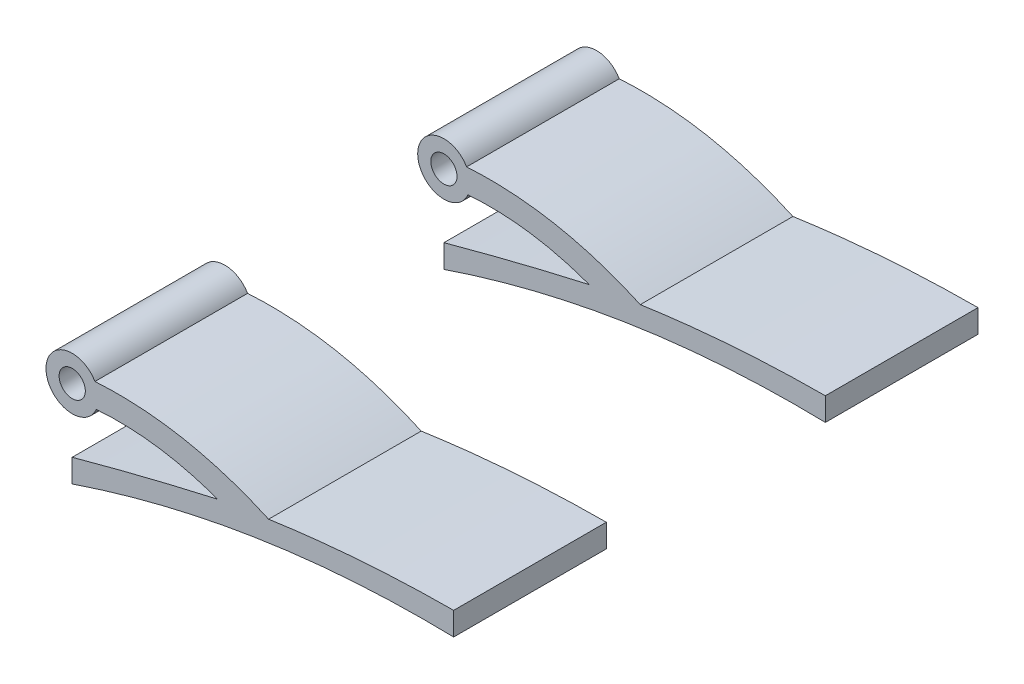
ISO-10303-21;
HEADER;
FILE_DESCRIPTION(('STEP AP214'),'2;1');
FILE_NAME('part.step','',(''),(''),'','','');
FILE_SCHEMA(('AUTOMOTIVE_DESIGN { 1 0 10303 214 1 1 1 1 }'));
ENDSEC;
DATA;
#1=APPLICATION_CONTEXT('core data for automotive mechanical design processes');
#2=APPLICATION_PROTOCOL_DEFINITION('international standard','automotive_design',2000,#1);
#3=PRODUCT_CONTEXT('',#1,'mechanical');
#4=PRODUCT('Part','Part','',(#3));
#5=PRODUCT_RELATED_PRODUCT_CATEGORY('part','',(#4));
#6=PRODUCT_DEFINITION_FORMATION('','',#4);
#7=PRODUCT_DEFINITION_CONTEXT('part definition',#1,'design');
#8=PRODUCT_DEFINITION('design','',#6,#7);
#9=PRODUCT_DEFINITION_SHAPE('','',#8);
#10=(LENGTH_UNIT() NAMED_UNIT(*) SI_UNIT(.MILLI.,.METRE.));
#11=(NAMED_UNIT(*) PLANE_ANGLE_UNIT() SI_UNIT($,.RADIAN.));
#12=(NAMED_UNIT(*) SI_UNIT($,.STERADIAN.) SOLID_ANGLE_UNIT());
#13=UNCERTAINTY_MEASURE_WITH_UNIT(LENGTH_MEASURE(1.E-05),#10,'distance_accuracy_value','');
#14=(GEOMETRIC_REPRESENTATION_CONTEXT(3) GLOBAL_UNCERTAINTY_ASSIGNED_CONTEXT((#13)) GLOBAL_UNIT_ASSIGNED_CONTEXT((#10,
#11,#12)) REPRESENTATION_CONTEXT('',''));
#15=CARTESIAN_POINT('',(0.,0.,0.));
#16=DIRECTION('',(0.,0.,1.));
#17=DIRECTION('',(1.,0.,0.));
#18=AXIS2_PLACEMENT_3D('',#15,#16,#17);
#19=CARTESIAN_POINT('',(0.,0.,254.));
#20=DIRECTION('',(0.,0.,-1.));
#21=DIRECTION('',(-1.,0.,0.));
#22=AXIS2_PLACEMENT_3D('',#19,#20,#21);
#23=CYLINDRICAL_SURFACE('',#22,25.4);
#24=CARTESIAN_POINT('',(0.,0.,-106.110786800683));
#25=DIRECTION('',(0.,0.,-1.));
#26=DIRECTION('',(-1.,0.,0.));
#27=AXIS2_PLACEMENT_3D('',#24,#25,#26);
#28=CIRCLE('',#27,25.4);
#29=CARTESIAN_POINT('',(23.3185784583835,-10.0699502819137,-106.110786800683));
#30=VERTEX_POINT('',#29);
#31=CARTESIAN_POINT('',(21.9970452561247,12.7,-106.110786800683));
#32=VERTEX_POINT('',#31);
#33=EDGE_CURVE('E69',#30,#32,#28,.T.);
#34=ORIENTED_EDGE('',*,*,#33,.T.);
#35=DIRECTION('',(0.,0.,-1.));
#36=VECTOR('',#35,1.);
#37=CARTESIAN_POINT('',(21.9970452561247,12.7,254.));
#38=LINE('',#37,#36);
#39=CARTESIAN_POINT('',(21.9970452561247,12.7,-254.));
#40=VERTEX_POINT('',#39);
#41=EDGE_CURVE('E318',#32,#40,#38,.T.);
#42=ORIENTED_EDGE('',*,*,#41,.T.);
#43=CARTESIAN_POINT('',(0.,0.,-254.));
#44=DIRECTION('',(0.,0.,1.));
#45=DIRECTION('',(1.,0.,0.));
#46=AXIS2_PLACEMENT_3D('',#43,#44,#45);
#47=CIRCLE('',#46,25.4);
#48=CARTESIAN_POINT('',(23.3185784583835,-10.0699502819137,-254.));
#49=VERTEX_POINT('',#48);
#50=EDGE_CURVE('E276',#40,#49,#47,.T.);
#51=ORIENTED_EDGE('',*,*,#50,.T.);
#52=DIRECTION('',(0.,0.,-1.));
#53=VECTOR('',#52,1.);
#54=CARTESIAN_POINT('',(23.3185784583835,-10.0699502819137,254.));
#55=LINE('',#54,#53);
#56=EDGE_CURVE('E305',#30,#49,#55,.T.);
#57=ORIENTED_EDGE('',*,*,#56,.F.);
#58=EDGE_LOOP('',(#34,#42,#51,#57));
#59=FACE_BOUND('',#58,.T.);
#60=ADVANCED_FACE('F49',(#59),#23,.T.);
#61=CARTESIAN_POINT('',(0.,0.,254.));
#62=DIRECTION('',(0.,0.,-1.));
#63=DIRECTION('',(-1.,0.,0.));
#64=AXIS2_PLACEMENT_3D('',#61,#62,#63);
#65=CYLINDRICAL_SURFACE('',#64,12.7);
#66=CARTESIAN_POINT('',(0.,0.,-106.110786800683));
#67=DIRECTION('',(0.,0.,-1.));
#68=DIRECTION('',(-1.,0.,0.));
#69=AXIS2_PLACEMENT_3D('',#66,#67,#68);
#70=CIRCLE('',#69,12.7);
#71=CARTESIAN_POINT('',(-12.7,0.,-106.110786800683));
#72=VERTEX_POINT('',#71);
#73=EDGE_CURVE('E12',#72,#72,#70,.T.);
#74=ORIENTED_EDGE('',*,*,#73,.F.);
#75=EDGE_LOOP('',(#74));
#76=FACE_BOUND('',#75,.T.);
#77=CARTESIAN_POINT('',(0.,0.,-254.));
#78=DIRECTION('',(0.,0.,1.));
#79=DIRECTION('',(1.,0.,0.));
#80=AXIS2_PLACEMENT_3D('',#77,#78,#79);
#81=CIRCLE('',#80,12.7);
#82=CARTESIAN_POINT('',(12.7,0.,-254.));
#83=VERTEX_POINT('',#82);
#84=EDGE_CURVE('E60',#83,#83,#81,.T.);
#85=ORIENTED_EDGE('',*,*,#84,.F.);
#86=EDGE_LOOP('',(#85));
#87=FACE_BOUND('',#86,.T.);
#88=ADVANCED_FACE('F160',(#76,#87),#65,.F.);
#89=CARTESIAN_POINT('',(190.25199529991,-18.7129449772534,254.));
#90=CARTESIAN_POINT('',(108.775317236133,18.1924732566216,254.));
#91=CARTESIAN_POINT('',(21.9970452561247,12.7,254.));
#92=B_SPLINE_CURVE_WITH_KNOTS('',2,(#89,#90,#91),.UNSPECIFIED.,.F.,.F.,(3,3),(0.,1.),.UNSPECIFIED.);
#93=DIRECTION('',(0.,0.,-1.));
#94=VECTOR('',#93,1.);
#95=SURFACE_OF_LINEAR_EXTRUSION('',#92,#94);
#96=ORIENTED_EDGE('',*,*,#41,.F.);
#97=CARTESIAN_POINT('',(190.25199529991,-18.7129449772534,-106.110786800683));
#98=CARTESIAN_POINT('',(108.775317236133,18.1924732566216,-106.110786800683));
#99=CARTESIAN_POINT('',(21.9970452561247,12.7,-106.110786800683));
#100=B_SPLINE_CURVE_WITH_KNOTS('',2,(#97,#98,#99),.UNSPECIFIED.,.F.,.F.,(3,3),(0.,1.),.UNSPECIFIED.);
#101=CARTESIAN_POINT('',(190.25199529991,-18.7129449772534,-106.110786800683));
#102=VERTEX_POINT('',#101);
#103=EDGE_CURVE('E140',#32,#102,#100,.F.);
#104=ORIENTED_EDGE('',*,*,#103,.T.);
#105=DIRECTION('',(0.,0.,-1.));
#106=VECTOR('',#105,1.);
#107=CARTESIAN_POINT('',(190.25199529991,-18.7129449772534,254.));
#108=LINE('',#107,#106);
#109=CARTESIAN_POINT('',(190.25199529991,-18.7129449772534,-254.));
#110=VERTEX_POINT('',#109);
#111=EDGE_CURVE('E136',#102,#110,#108,.T.);
#112=ORIENTED_EDGE('',*,*,#111,.T.);
#113=CARTESIAN_POINT('',(190.25199529991,-18.7129449772534,-254.));
#114=CARTESIAN_POINT('',(108.775317236133,18.1924732566216,-254.));
#115=CARTESIAN_POINT('',(21.9970452561247,12.7,-254.));
#116=B_SPLINE_CURVE_WITH_KNOTS('',2,(#113,#114,#115),.UNSPECIFIED.,.F.,.F.,(3,3),(0.,1.),.UNSPECIFIED.);
#117=EDGE_CURVE('E139',#110,#40,#116,.T.);
#118=ORIENTED_EDGE('',*,*,#117,.T.);
#119=EDGE_LOOP('',(#96,#104,#112,#118));
#120=FACE_BOUND('',#119,.T.);
#121=ADVANCED_FACE('F187',(#120),#95,.F.);
#122=CARTESIAN_POINT('',(23.3185784583835,-10.0699502819137,254.));
#123=CARTESIAN_POINT('',(83.5049903110363,-5.48230526075079,254.));
#124=CARTESIAN_POINT('',(140.749293009898,-26.6578724186735,254.));
#125=B_SPLINE_CURVE_WITH_KNOTS('',2,(#122,#123,#124),.UNSPECIFIED.,.F.,.F.,(3,3),(0.,1.),.UNSPECIFIED.);
#126=DIRECTION('',(0.,0.,-1.));
#127=VECTOR('',#126,1.);
#128=SURFACE_OF_LINEAR_EXTRUSION('',#125,#127);
#129=DIRECTION('',(0.,0.,-1.));
#130=VECTOR('',#129,1.);
#131=CARTESIAN_POINT('',(140.749293009898,-26.6578724186735,254.));
#132=LINE('',#131,#130);
#133=CARTESIAN_POINT('',(140.749293009898,-26.6578724186735,-106.110786800683));
#134=VERTEX_POINT('',#133);
#135=CARTESIAN_POINT('',(140.749293009898,-26.6578724186735,-254.));
#136=VERTEX_POINT('',#135);
#137=EDGE_CURVE('E296',#134,#136,#132,.T.);
#138=ORIENTED_EDGE('',*,*,#137,.F.);
#139=CARTESIAN_POINT('',(23.3185784583835,-10.0699502819137,-106.110786800683));
#140=CARTESIAN_POINT('',(83.5049903110363,-5.48230526075079,-106.110786800683));
#141=CARTESIAN_POINT('',(140.749293009898,-26.6578724186735,-106.110786800683));
#142=B_SPLINE_CURVE_WITH_KNOTS('',2,(#139,#140,#141),.UNSPECIFIED.,.F.,.F.,(3,3),(0.,1.),.UNSPECIFIED.);
#143=EDGE_CURVE('E312',#134,#30,#142,.F.);
#144=ORIENTED_EDGE('',*,*,#143,.T.);
#145=ORIENTED_EDGE('',*,*,#56,.T.);
#146=CARTESIAN_POINT('',(23.3185784583835,-10.0699502819137,-254.));
#147=CARTESIAN_POINT('',(83.5049903110363,-5.48230526075079,-254.));
#148=CARTESIAN_POINT('',(140.749293009898,-26.6578724186735,-254.));
#149=B_SPLINE_CURVE_WITH_KNOTS('',2,(#146,#147,#148),.UNSPECIFIED.,.F.,.F.,(3,3),(0.,1.),.UNSPECIFIED.);
#150=EDGE_CURVE('E297',#49,#136,#149,.T.);
#151=ORIENTED_EDGE('',*,*,#150,.T.);
#152=EDGE_LOOP('',(#138,#144,#145,#151));
#153=FACE_BOUND('',#152,.T.);
#154=ADVANCED_FACE('F172',(#153),#128,.F.);
#155=CARTESIAN_POINT('',(140.749293009898,-26.6578724186735,254.));
#156=CARTESIAN_POINT('',(69.9757898089129,-42.6269154689472,254.));
#157=CARTESIAN_POINT('',(0.,-61.8728914679129,254.));
#158=B_SPLINE_CURVE_WITH_KNOTS('',2,(#155,#156,#157),.UNSPECIFIED.,.F.,.F.,(3,3),(0.,1.),.UNSPECIFIED.);
#159=DIRECTION('',(0.,0.,-1.));
#160=VECTOR('',#159,1.);
#161=SURFACE_OF_LINEAR_EXTRUSION('',#158,#160);
#162=DIRECTION('',(0.,0.,-1.));
#163=VECTOR('',#162,1.);
#164=CARTESIAN_POINT('',(0.,-61.8728914679129,254.));
#165=LINE('',#164,#163);
#166=CARTESIAN_POINT('',(0.,-61.8728914679129,-106.110786800683));
#167=VERTEX_POINT('',#166);
#168=CARTESIAN_POINT('',(0.,-61.8728914679129,-254.));
#169=VERTEX_POINT('',#168);
#170=EDGE_CURVE('E104',#167,#169,#165,.T.);
#171=ORIENTED_EDGE('',*,*,#170,.F.);
#172=CARTESIAN_POINT('',(140.749293009898,-26.6578724186735,-106.110786800683));
#173=CARTESIAN_POINT('',(69.9757898089129,-42.6269154689472,-106.110786800683));
#174=CARTESIAN_POINT('',(0.,-61.8728914679129,-106.110786800683));
#175=B_SPLINE_CURVE_WITH_KNOTS('',2,(#172,#173,#174),.UNSPECIFIED.,.F.,.F.,(3,3),(0.,1.),.UNSPECIFIED.);
#176=EDGE_CURVE('E99',#167,#134,#175,.F.);
#177=ORIENTED_EDGE('',*,*,#176,.T.);
#178=ORIENTED_EDGE('',*,*,#137,.T.);
#179=CARTESIAN_POINT('',(140.749293009898,-26.6578724186735,-254.));
#180=CARTESIAN_POINT('',(69.9757898089129,-42.6269154689472,-254.));
#181=CARTESIAN_POINT('',(0.,-61.8728914679129,-254.));
#182=B_SPLINE_CURVE_WITH_KNOTS('',2,(#179,#180,#181),.UNSPECIFIED.,.F.,.F.,(3,3),(0.,1.),.UNSPECIFIED.);
#183=EDGE_CURVE('E105',#136,#169,#182,.T.);
#184=ORIENTED_EDGE('',*,*,#183,.T.);
#185=EDGE_LOOP('',(#171,#177,#178,#184));
#186=FACE_BOUND('',#185,.T.);
#187=ADVANCED_FACE('F169',(#186),#161,.F.);
#188=CARTESIAN_POINT('',(0.,-61.8728914679129,254.));
#189=DIRECTION('',(1.,0.,0.));
#190=DIRECTION('',(0.,0.,-1.));
#191=AXIS2_PLACEMENT_3D('',#188,#189,#190);
#192=PLANE('',#191);
#193=DIRECTION('',(0.,0.,-1.));
#194=VECTOR('',#193,1.);
#195=CARTESIAN_POINT('',(0.,-84.2794745953135,254.));
#196=LINE('',#195,#194);
#197=CARTESIAN_POINT('',(0.,-84.2794745953135,-106.110786800683));
#198=VERTEX_POINT('',#197);
#199=CARTESIAN_POINT('',(0.,-84.2794745953135,-254.));
#200=VERTEX_POINT('',#199);
#201=EDGE_CURVE('E113',#198,#200,#196,.T.);
#202=ORIENTED_EDGE('',*,*,#201,.F.);
#203=DIRECTION('',(0.,1.,0.));
#204=VECTOR('',#203,1.);
#205=CARTESIAN_POINT('',(0.,-61.8728914679129,-106.110786800683));
#206=LINE('',#205,#204);
#207=EDGE_CURVE('E96',#198,#167,#206,.T.);
#208=ORIENTED_EDGE('',*,*,#207,.T.);
#209=ORIENTED_EDGE('',*,*,#170,.T.);
#210=DIRECTION('',(0.,-1.,0.));
#211=VECTOR('',#210,1.);
#212=CARTESIAN_POINT('',(0.,-61.8728914679129,-254.));
#213=LINE('',#212,#211);
#214=EDGE_CURVE('E117',#169,#200,#213,.T.);
#215=ORIENTED_EDGE('',*,*,#214,.T.);
#216=EDGE_LOOP('',(#202,#208,#209,#215));
#217=FACE_BOUND('',#216,.T.);
#218=ADVANCED_FACE('F119',(#217),#192,.F.);
#219=CARTESIAN_POINT('',(0.,-84.2794745953135,254.));
#220=CARTESIAN_POINT('',(179.154342515217,-23.5221422147455,254.));
#221=CARTESIAN_POINT('',(369.568923203095,-27.9235230930635,254.));
#222=B_SPLINE_CURVE_WITH_KNOTS('',2,(#219,#220,#221),.UNSPECIFIED.,.F.,.F.,(3,3),(0.,1.),.UNSPECIFIED.);
#223=DIRECTION('',(0.,0.,-1.));
#224=VECTOR('',#223,1.);
#225=SURFACE_OF_LINEAR_EXTRUSION('',#222,#224);
#226=DIRECTION('',(0.,0.,-1.));
#227=VECTOR('',#226,1.);
#228=CARTESIAN_POINT('',(369.568923203095,-27.9235230930635,254.));
#229=LINE('',#228,#227);
#230=CARTESIAN_POINT('',(369.568923203095,-27.9235230930635,-106.110786800683));
#231=VERTEX_POINT('',#230);
#232=CARTESIAN_POINT('',(369.568923203095,-27.9235230930635,-254.));
#233=VERTEX_POINT('',#232);
#234=EDGE_CURVE('E116',#231,#233,#229,.T.);
#235=ORIENTED_EDGE('',*,*,#234,.F.);
#236=CARTESIAN_POINT('',(0.,-84.2794745953135,-106.110786800683));
#237=CARTESIAN_POINT('',(179.154342515217,-23.5221422147455,-106.110786800683));
#238=CARTESIAN_POINT('',(369.568923203095,-27.9235230930635,-106.110786800683));
#239=B_SPLINE_CURVE_WITH_KNOTS('',2,(#236,#237,#238),.UNSPECIFIED.,.F.,.F.,(3,3),(0.,1.),.UNSPECIFIED.);
#240=EDGE_CURVE('E92',#231,#198,#239,.F.);
#241=ORIENTED_EDGE('',*,*,#240,.T.);
#242=ORIENTED_EDGE('',*,*,#201,.T.);
#243=CARTESIAN_POINT('',(0.,-84.2794745953135,-254.));
#244=CARTESIAN_POINT('',(179.154342515217,-23.5221422147455,-254.));
#245=CARTESIAN_POINT('',(369.568923203095,-27.9235230930635,-254.));
#246=B_SPLINE_CURVE_WITH_KNOTS('',2,(#243,#244,#245),.UNSPECIFIED.,.F.,.F.,(3,3),(0.,1.),.UNSPECIFIED.);
#247=EDGE_CURVE('E122',#200,#233,#246,.T.);
#248=ORIENTED_EDGE('',*,*,#247,.T.);
#249=EDGE_LOOP('',(#235,#241,#242,#248));
#250=FACE_BOUND('',#249,.T.);
#251=ADVANCED_FACE('F110',(#250),#225,.F.);
#252=CARTESIAN_POINT('',(369.568923203095,-5.51693996566296,254.));
#253=DIRECTION('',(-1.,0.,0.));
#254=DIRECTION('',(0.,0.,1.));
#255=AXIS2_PLACEMENT_3D('',#252,#253,#254);
#256=PLANE('',#255);
#257=DIRECTION('',(0.,0.,-1.));
#258=VECTOR('',#257,1.);
#259=CARTESIAN_POINT('',(369.568923203095,-5.51693996566296,254.));
#260=LINE('',#259,#258);
#261=CARTESIAN_POINT('',(369.568923203095,-5.51693996566296,-106.110786800683));
#262=VERTEX_POINT('',#261);
#263=CARTESIAN_POINT('',(369.568923203095,-5.51693996566296,-254.));
#264=VERTEX_POINT('',#263);
#265=EDGE_CURVE('E131',#262,#264,#260,.T.);
#266=ORIENTED_EDGE('',*,*,#265,.F.);
#267=DIRECTION('',(0.,-1.,0.));
#268=VECTOR('',#267,1.);
#269=CARTESIAN_POINT('',(369.568923203095,-5.51693996566296,-106.110786800683));
#270=LINE('',#269,#268);
#271=EDGE_CURVE('E124',#262,#231,#270,.T.);
#272=ORIENTED_EDGE('',*,*,#271,.T.);
#273=ORIENTED_EDGE('',*,*,#234,.T.);
#274=DIRECTION('',(0.,1.,0.));
#275=VECTOR('',#274,1.);
#276=CARTESIAN_POINT('',(369.568923203095,-5.51693996566296,-254.));
#277=LINE('',#276,#275);
#278=EDGE_CURVE('E130',#233,#264,#277,.T.);
#279=ORIENTED_EDGE('',*,*,#278,.T.);
#280=EDGE_LOOP('',(#266,#272,#273,#279));
#281=FACE_BOUND('',#280,.T.);
#282=ADVANCED_FACE('F158',(#281),#256,.F.);
#283=CARTESIAN_POINT('',(369.568923203095,-5.51693996566296,254.));
#284=CARTESIAN_POINT('',(278.712063384349,-5.8165666840919,254.));
#285=CARTESIAN_POINT('',(190.25199529991,-18.7129449772534,254.));
#286=B_SPLINE_CURVE_WITH_KNOTS('',2,(#283,#284,#285),.UNSPECIFIED.,.F.,.F.,(3,3),
(0.521873105138815,1.),.UNSPECIFIED.);
#287=DIRECTION('',(0.,0.,-1.));
#288=VECTOR('',#287,1.);
#289=SURFACE_OF_LINEAR_EXTRUSION('',#286,#288);
#290=ORIENTED_EDGE('',*,*,#111,.F.);
#291=CARTESIAN_POINT('',(369.568923203095,-5.51693996566296,-106.110786800683));
#292=CARTESIAN_POINT('',(278.712063384349,-5.8165666840919,-106.110786800683));
#293=CARTESIAN_POINT('',(190.25199529991,-18.7129449772534,-106.110786800683));
#294=B_SPLINE_CURVE_WITH_KNOTS('',2,(#291,#292,#293),.UNSPECIFIED.,.F.,.F.,(3,3),
(0.521873105138815,1.),.UNSPECIFIED.);
#295=EDGE_CURVE('E135',#102,#262,#294,.F.);
#296=ORIENTED_EDGE('',*,*,#295,.T.);
#297=ORIENTED_EDGE('',*,*,#265,.T.);
#298=CARTESIAN_POINT('',(369.568923203095,-5.51693996566296,-254.));
#299=CARTESIAN_POINT('',(278.712063384349,-5.8165666840919,-254.));
#300=CARTESIAN_POINT('',(190.25199529991,-18.7129449772534,-254.));
#301=B_SPLINE_CURVE_WITH_KNOTS('',2,(#298,#299,#300),.UNSPECIFIED.,.F.,.F.,(3,3),
(0.521873105138815,1.),.UNSPECIFIED.);
#302=EDGE_CURVE('E134',#264,#110,#301,.T.);
#303=ORIENTED_EDGE('',*,*,#302,.T.);
#304=EDGE_LOOP('',(#290,#296,#297,#303));
#305=FACE_BOUND('',#304,.T.);
#306=ADVANCED_FACE('F153',(#305),#289,.F.);
#307=CARTESIAN_POINT('',(0.,0.,-254.));
#308=DIRECTION('',(0.,0.,1.));
#309=DIRECTION('',(1.,0.,0.));
#310=AXIS2_PLACEMENT_3D('',#307,#308,#309);
#311=PLANE('',#310);
#312=ORIENTED_EDGE('',*,*,#50,.F.);
#313=ORIENTED_EDGE('',*,*,#117,.F.);
#314=ORIENTED_EDGE('',*,*,#302,.F.);
#315=ORIENTED_EDGE('',*,*,#278,.F.);
#316=ORIENTED_EDGE('',*,*,#247,.F.);
#317=ORIENTED_EDGE('',*,*,#214,.F.);
#318=ORIENTED_EDGE('',*,*,#183,.F.);
#319=ORIENTED_EDGE('',*,*,#150,.F.);
#320=EDGE_LOOP('',(#312,#313,#314,#315,#316,#317,#318,#319));
#321=FACE_BOUND('',#320,.T.);
#322=ORIENTED_EDGE('',*,*,#84,.T.);
#323=EDGE_LOOP('',(#322));
#324=FACE_BOUND('',#323,.T.);
#325=ADVANCED_FACE('F157',(#321,#324),#311,.F.);
#326=CARTESIAN_POINT('',(-25.4,-84.2794745953135,-106.110786800683));
#327=DIRECTION('',(0.,0.,-1.));
#328=DIRECTION('',(-1.,0.,0.));
#329=AXIS2_PLACEMENT_3D('',#326,#327,#328);
#330=PLANE('',#329);
#331=ORIENTED_EDGE('',*,*,#73,.T.);
#332=EDGE_LOOP('',(#331));
#333=FACE_BOUND('',#332,.T.);
#334=ORIENTED_EDGE('',*,*,#33,.F.);
#335=ORIENTED_EDGE('',*,*,#143,.F.);
#336=ORIENTED_EDGE('',*,*,#176,.F.);
#337=ORIENTED_EDGE('',*,*,#207,.F.);
#338=ORIENTED_EDGE('',*,*,#240,.F.);
#339=ORIENTED_EDGE('',*,*,#271,.F.);
#340=ORIENTED_EDGE('',*,*,#295,.F.);
#341=ORIENTED_EDGE('',*,*,#103,.F.);
#342=EDGE_LOOP('',(#334,#335,#336,#337,#338,#339,#340,#341));
#343=FACE_BOUND('',#342,.T.);
#344=ADVANCED_FACE('F97',(#333,#343),#330,.F.);
#345=CLOSED_SHELL('',(#60,#88,#121,#154,#187,#218,#251,#282,#306,#325,#344));
#346=MANIFOLD_SOLID_BREP('B2',#345);
#347=CARTESIAN_POINT('',(0.,0.,254.));
#348=DIRECTION('',(0.,0.,-1.));
#349=DIRECTION('',(-1.,0.,0.));
#350=AXIS2_PLACEMENT_3D('',#347,#348,#349);
#351=CYLINDRICAL_SURFACE('',#350,12.7);
#352=CARTESIAN_POINT('',(0.,0.,106.110786800683));
#353=DIRECTION('',(0.,0.,1.));
#354=DIRECTION('',(1.,0.,0.));
#355=AXIS2_PLACEMENT_3D('',#352,#353,#354);
#356=CIRCLE('',#355,12.7);
#357=CARTESIAN_POINT('',(12.7,0.,106.110786800683));
#358=VERTEX_POINT('',#357);
#359=EDGE_CURVE('E523',#358,#358,#356,.T.);
#360=ORIENTED_EDGE('',*,*,#359,.F.);
#361=EDGE_LOOP('',(#360));
#362=FACE_BOUND('',#361,.T.);
#363=CARTESIAN_POINT('',(0.,0.,254.));
#364=DIRECTION('',(0.,0.,1.));
#365=DIRECTION('',(1.,0.,0.));
#366=AXIS2_PLACEMENT_3D('',#363,#364,#365);
#367=CIRCLE('',#366,12.7);
#368=CARTESIAN_POINT('',(12.7,0.,254.));
#369=VERTEX_POINT('',#368);
#370=EDGE_CURVE('E498',#369,#369,#367,.T.);
#371=ORIENTED_EDGE('',*,*,#370,.T.);
#372=EDGE_LOOP('',(#371));
#373=FACE_BOUND('',#372,.T.);
#374=ADVANCED_FACE('F386',(#362,#373),#351,.F.);
#375=CARTESIAN_POINT('',(0.,0.,254.));
#376=DIRECTION('',(0.,0.,1.));
#377=DIRECTION('',(1.,0.,0.));
#378=AXIS2_PLACEMENT_3D('',#375,#376,#377);
#379=PLANE('',#378);
#380=CARTESIAN_POINT('',(0.,0.,254.));
#381=DIRECTION('',(0.,0.,1.));
#382=DIRECTION('',(1.,0.,0.));
#383=AXIS2_PLACEMENT_3D('',#380,#381,#382);
#384=CIRCLE('',#383,25.4);
#385=CARTESIAN_POINT('',(21.9970452561247,12.7,254.));
#386=VERTEX_POINT('',#385);
#387=CARTESIAN_POINT('',(23.3185784583835,-10.0699502819137,254.));
#388=VERTEX_POINT('',#387);
#389=EDGE_CURVE('E397',#386,#388,#384,.T.);
#390=ORIENTED_EDGE('',*,*,#389,.T.);
#391=CARTESIAN_POINT('',(23.3185784583835,-10.0699502819137,254.));
#392=CARTESIAN_POINT('',(83.5049903110363,-5.48230526075079,254.));
#393=CARTESIAN_POINT('',(140.749293009898,-26.6578724186735,254.));
#394=B_SPLINE_CURVE_WITH_KNOTS('',2,(#391,#392,#393),.UNSPECIFIED.,.F.,.F.,(3,3),(0.,1.),.UNSPECIFIED.);
#395=CARTESIAN_POINT('',(140.749293009898,-26.6578724186735,254.));
#396=VERTEX_POINT('',#395);
#397=EDGE_CURVE('E507',#388,#396,#394,.T.);
#398=ORIENTED_EDGE('',*,*,#397,.T.);
#399=CARTESIAN_POINT('',(140.749293009898,-26.6578724186735,254.));
#400=CARTESIAN_POINT('',(69.9757898089129,-42.6269154689472,254.));
#401=CARTESIAN_POINT('',(0.,-61.8728914679129,254.));
#402=B_SPLINE_CURVE_WITH_KNOTS('',2,(#399,#400,#401),.UNSPECIFIED.,.F.,.F.,(3,3),(0.,1.),.UNSPECIFIED.);
#403=CARTESIAN_POINT('',(0.,-61.8728914679129,254.));
#404=VERTEX_POINT('',#403);
#405=EDGE_CURVE('E517',#396,#404,#402,.T.);
#406=ORIENTED_EDGE('',*,*,#405,.T.);
#407=DIRECTION('',(0.,-1.,0.));
#408=VECTOR('',#407,1.);
#409=CARTESIAN_POINT('',(0.,-61.8728914679129,254.));
#410=LINE('',#409,#408);
#411=CARTESIAN_POINT('',(0.,-84.2794745953135,254.));
#412=VERTEX_POINT('',#411);
#413=EDGE_CURVE('E521',#404,#412,#410,.T.);
#414=ORIENTED_EDGE('',*,*,#413,.T.);
#415=CARTESIAN_POINT('',(0.,-84.2794745953135,254.));
#416=CARTESIAN_POINT('',(179.154342515217,-23.5221422147455,254.));
#417=CARTESIAN_POINT('',(369.568923203095,-27.9235230930635,254.));
#418=B_SPLINE_CURVE_WITH_KNOTS('',2,(#415,#416,#417),.UNSPECIFIED.,.F.,.F.,(3,3),(0.,1.),.UNSPECIFIED.);
#419=CARTESIAN_POINT('',(369.568923203095,-27.9235230930635,254.));
#420=VERTEX_POINT('',#419);
#421=EDGE_CURVE('E477',#412,#420,#418,.T.);
#422=ORIENTED_EDGE('',*,*,#421,.T.);
#423=DIRECTION('',(0.,1.,0.));
#424=VECTOR('',#423,1.);
#425=CARTESIAN_POINT('',(369.568923203095,-5.51693996566296,254.));
#426=LINE('',#425,#424);
#427=CARTESIAN_POINT('',(369.568923203095,-5.51693996566296,254.));
#428=VERTEX_POINT('',#427);
#429=EDGE_CURVE('E576',#420,#428,#426,.T.);
#430=ORIENTED_EDGE('',*,*,#429,.T.);
#431=CARTESIAN_POINT('',(369.568923203095,-5.51693996566296,254.));
#432=CARTESIAN_POINT('',(278.712063384349,-5.8165666840919,254.));
#433=CARTESIAN_POINT('',(190.25199529991,-18.7129449772534,254.));
#434=B_SPLINE_CURVE_WITH_KNOTS('',2,(#431,#432,#433),.UNSPECIFIED.,.F.,.F.,(3,3),
(0.521873105138815,1.),.UNSPECIFIED.);
#435=CARTESIAN_POINT('',(190.25199529991,-18.7129449772534,254.));
#436=VERTEX_POINT('',#435);
#437=EDGE_CURVE('E568',#428,#436,#434,.T.);
#438=ORIENTED_EDGE('',*,*,#437,.T.);
#439=CARTESIAN_POINT('',(190.25199529991,-18.7129449772534,254.));
#440=CARTESIAN_POINT('',(108.775317236133,18.1924732566216,254.));
#441=CARTESIAN_POINT('',(21.9970452561247,12.7,254.));
#442=B_SPLINE_CURVE_WITH_KNOTS('',2,(#439,#440,#441),.UNSPECIFIED.,.F.,.F.,(3,3),(0.,1.),.UNSPECIFIED.);
#443=EDGE_CURVE('E510',#436,#386,#442,.T.);
#444=ORIENTED_EDGE('',*,*,#443,.T.);
#445=EDGE_LOOP('',(#390,#398,#406,#414,#422,#430,#438,#444));
#446=FACE_BOUND('',#445,.T.);
#447=ORIENTED_EDGE('',*,*,#370,.F.);
#448=EDGE_LOOP('',(#447));
#449=FACE_BOUND('',#448,.T.);
#450=ADVANCED_FACE('F505',(#446,#449),#379,.T.);
#451=DIRECTION('',(0.,0.,-1.));
#452=VECTOR('',#451,1.);
#453=SURFACE_OF_LINEAR_EXTRUSION('',#434,#452);
#454=DIRECTION('',(0.,0.,-1.));
#455=VECTOR('',#454,1.);
#456=CARTESIAN_POINT('',(369.568923203095,-5.51693996566296,254.));
#457=LINE('',#456,#455);
#458=CARTESIAN_POINT('',(369.568923203095,-5.51693996566296,106.110786800683));
#459=VERTEX_POINT('',#458);
#460=EDGE_CURVE('E485',#428,#459,#457,.T.);
#461=ORIENTED_EDGE('',*,*,#460,.T.);
#462=CARTESIAN_POINT('',(369.568923203095,-5.51693996566296,106.110786800683));
#463=CARTESIAN_POINT('',(278.712063384349,-5.8165666840919,106.110786800683));
#464=CARTESIAN_POINT('',(190.25199529991,-18.7129449772534,106.110786800683));
#465=B_SPLINE_CURVE_WITH_KNOTS('',2,(#462,#463,#464),.UNSPECIFIED.,.F.,.F.,(3,3),
(0.521873105138815,1.),.UNSPECIFIED.);
#466=CARTESIAN_POINT('',(190.25199529991,-18.7129449772534,106.110786800683));
#467=VERTEX_POINT('',#466);
#468=EDGE_CURVE('E47',#459,#467,#465,.T.);
#469=ORIENTED_EDGE('',*,*,#468,.T.);
#470=DIRECTION('',(0.,0.,-1.));
#471=VECTOR('',#470,1.);
#472=CARTESIAN_POINT('',(190.25199529991,-18.7129449772534,254.));
#473=LINE('',#472,#471);
#474=EDGE_CURVE('E575',#436,#467,#473,.T.);
#475=ORIENTED_EDGE('',*,*,#474,.F.);
#476=ORIENTED_EDGE('',*,*,#437,.F.);
#477=EDGE_LOOP('',(#461,#469,#475,#476));
#478=FACE_BOUND('',#477,.T.);
#479=ADVANCED_FACE('F552',(#478),#453,.F.);
#480=CARTESIAN_POINT('',(369.568923203095,-5.51693996566296,254.));
#481=DIRECTION('',(-1.,0.,0.));
#482=DIRECTION('',(0.,0.,1.));
#483=AXIS2_PLACEMENT_3D('',#480,#481,#482);
#484=PLANE('',#483);
#485=DIRECTION('',(0.,0.,-1.));
#486=VECTOR('',#485,1.);
#487=CARTESIAN_POINT('',(369.568923203095,-27.9235230930635,254.));
#488=LINE('',#487,#486);
#489=CARTESIAN_POINT('',(369.568923203095,-27.9235230930635,106.110786800683));
#490=VERTEX_POINT('',#489);
#491=EDGE_CURVE('E479',#420,#490,#488,.T.);
#492=ORIENTED_EDGE('',*,*,#491,.T.);
#493=DIRECTION('',(0.,1.,0.));
#494=VECTOR('',#493,1.);
#495=CARTESIAN_POINT('',(369.568923203095,-5.51693996566296,106.110786800683));
#496=LINE('',#495,#494);
#497=EDGE_CURVE('E457',#490,#459,#496,.T.);
#498=ORIENTED_EDGE('',*,*,#497,.T.);
#499=ORIENTED_EDGE('',*,*,#460,.F.);
#500=ORIENTED_EDGE('',*,*,#429,.F.);
#501=EDGE_LOOP('',(#492,#498,#499,#500));
#502=FACE_BOUND('',#501,.T.);
#503=ADVANCED_FACE('F556',(#502),#484,.F.);
#504=DIRECTION('',(0.,0.,-1.));
#505=VECTOR('',#504,1.);
#506=SURFACE_OF_LINEAR_EXTRUSION('',#418,#505);
#507=DIRECTION('',(0.,0.,-1.));
#508=VECTOR('',#507,1.);
#509=CARTESIAN_POINT('',(0.,-84.2794745953135,254.));
#510=LINE('',#509,#508);
#511=CARTESIAN_POINT('',(0.,-84.2794745953135,106.110786800683));
#512=VERTEX_POINT('',#511);
#513=EDGE_CURVE('E469',#412,#512,#510,.T.);
#514=ORIENTED_EDGE('',*,*,#513,.T.);
#515=CARTESIAN_POINT('',(0.,-84.2794745953135,106.110786800683));
#516=CARTESIAN_POINT('',(179.154342515217,-23.5221422147455,106.110786800683));
#517=CARTESIAN_POINT('',(369.568923203095,-27.9235230930635,106.110786800683));
#518=B_SPLINE_CURVE_WITH_KNOTS('',2,(#515,#516,#517),.UNSPECIFIED.,.F.,.F.,(3,3),(0.,1.),.UNSPECIFIED.);
#519=EDGE_CURVE('E451',#512,#490,#518,.T.);
#520=ORIENTED_EDGE('',*,*,#519,.T.);
#521=ORIENTED_EDGE('',*,*,#491,.F.);
#522=ORIENTED_EDGE('',*,*,#421,.F.);
#523=EDGE_LOOP('',(#514,#520,#521,#522));
#524=FACE_BOUND('',#523,.T.);
#525=ADVANCED_FACE('F476',(#524),#506,.F.);
#526=CARTESIAN_POINT('',(0.,-61.8728914679129,254.));
#527=DIRECTION('',(1.,0.,0.));
#528=DIRECTION('',(0.,0.,-1.));
#529=AXIS2_PLACEMENT_3D('',#526,#527,#528);
#530=PLANE('',#529);
#531=DIRECTION('',(0.,0.,-1.));
#532=VECTOR('',#531,1.);
#533=CARTESIAN_POINT('',(0.,-61.8728914679129,254.));
#534=LINE('',#533,#532);
#535=CARTESIAN_POINT('',(0.,-61.8728914679129,106.110786800683));
#536=VERTEX_POINT('',#535);
#537=EDGE_CURVE('E472',#404,#536,#534,.T.);
#538=ORIENTED_EDGE('',*,*,#537,.T.);
#539=DIRECTION('',(0.,-1.,0.));
#540=VECTOR('',#539,1.);
#541=CARTESIAN_POINT('',(0.,-61.8728914679129,106.110786800683));
#542=LINE('',#541,#540);
#543=EDGE_CURVE('E454',#536,#512,#542,.T.);
#544=ORIENTED_EDGE('',*,*,#543,.T.);
#545=ORIENTED_EDGE('',*,*,#513,.F.);
#546=ORIENTED_EDGE('',*,*,#413,.F.);
#547=EDGE_LOOP('',(#538,#544,#545,#546));
#548=FACE_BOUND('',#547,.T.);
#549=ADVANCED_FACE('F467',(#548),#530,.F.);
#550=DIRECTION('',(0.,0.,-1.));
#551=VECTOR('',#550,1.);
#552=SURFACE_OF_LINEAR_EXTRUSION('',#402,#551);
#553=DIRECTION('',(0.,0.,-1.));
#554=VECTOR('',#553,1.);
#555=CARTESIAN_POINT('',(140.749293009898,-26.6578724186735,254.));
#556=LINE('',#555,#554);
#557=CARTESIAN_POINT('',(140.749293009898,-26.6578724186735,106.110786800683));
#558=VERTEX_POINT('',#557);
#559=EDGE_CURVE('E483',#396,#558,#556,.T.);
#560=ORIENTED_EDGE('',*,*,#559,.T.);
#561=CARTESIAN_POINT('',(140.749293009898,-26.6578724186735,106.110786800683));
#562=CARTESIAN_POINT('',(69.9757898089129,-42.6269154689472,106.110786800683));
#563=CARTESIAN_POINT('',(0.,-61.8728914679129,106.110786800683));
#564=B_SPLINE_CURVE_WITH_KNOTS('',2,(#561,#562,#563),.UNSPECIFIED.,.F.,.F.,(3,3),(0.,1.),.UNSPECIFIED.);
#565=EDGE_CURVE('E474',#558,#536,#564,.T.);
#566=ORIENTED_EDGE('',*,*,#565,.T.);
#567=ORIENTED_EDGE('',*,*,#537,.F.);
#568=ORIENTED_EDGE('',*,*,#405,.F.);
#569=EDGE_LOOP('',(#560,#566,#567,#568));
#570=FACE_BOUND('',#569,.T.);
#571=ADVANCED_FACE('F544',(#570),#552,.F.);
#572=DIRECTION('',(0.,0.,-1.));
#573=VECTOR('',#572,1.);
#574=SURFACE_OF_LINEAR_EXTRUSION('',#394,#573);
#575=DIRECTION('',(0.,0.,-1.));
#576=VECTOR('',#575,1.);
#577=CARTESIAN_POINT('',(23.3185784583835,-10.0699502819137,254.));
#578=LINE('',#577,#576);
#579=CARTESIAN_POINT('',(23.3185784583835,-10.0699502819137,106.110786800683));
#580=VERTEX_POINT('',#579);
#581=EDGE_CURVE('E411',#388,#580,#578,.T.);
#582=ORIENTED_EDGE('',*,*,#581,.T.);
#583=CARTESIAN_POINT('',(23.3185784583835,-10.0699502819137,106.110786800683));
#584=CARTESIAN_POINT('',(83.5049903110363,-5.48230526075079,106.110786800683));
#585=CARTESIAN_POINT('',(140.749293009898,-26.6578724186735,106.110786800683));
#586=B_SPLINE_CURVE_WITH_KNOTS('',2,(#583,#584,#585),.UNSPECIFIED.,.F.,.F.,(3,3),(0.,1.),.UNSPECIFIED.);
#587=EDGE_CURVE('E600',#580,#558,#586,.T.);
#588=ORIENTED_EDGE('',*,*,#587,.T.);
#589=ORIENTED_EDGE('',*,*,#559,.F.);
#590=ORIENTED_EDGE('',*,*,#397,.F.);
#591=EDGE_LOOP('',(#582,#588,#589,#590));
#592=FACE_BOUND('',#591,.T.);
#593=ADVANCED_FACE('F513',(#592),#574,.F.);
#594=DIRECTION('',(0.,0.,-1.));
#595=VECTOR('',#594,1.);
#596=SURFACE_OF_LINEAR_EXTRUSION('',#442,#595);
#597=ORIENTED_EDGE('',*,*,#474,.T.);
#598=CARTESIAN_POINT('',(190.25199529991,-18.7129449772534,106.110786800683));
#599=CARTESIAN_POINT('',(108.775317236133,18.1924732566216,106.110786800683));
#600=CARTESIAN_POINT('',(21.9970452561247,12.7,106.110786800683));
#601=B_SPLINE_CURVE_WITH_KNOTS('',2,(#598,#599,#600),.UNSPECIFIED.,.F.,.F.,(3,3),(0.,1.),.UNSPECIFIED.);
#602=CARTESIAN_POINT('',(21.9970452561247,12.7,106.110786800683));
#603=VERTEX_POINT('',#602);
#604=EDGE_CURVE('E404',#467,#603,#601,.T.);
#605=ORIENTED_EDGE('',*,*,#604,.T.);
#606=DIRECTION('',(0.,0.,-1.));
#607=VECTOR('',#606,1.);
#608=CARTESIAN_POINT('',(21.9970452561247,12.7,254.));
#609=LINE('',#608,#607);
#610=EDGE_CURVE('E494',#386,#603,#609,.T.);
#611=ORIENTED_EDGE('',*,*,#610,.F.);
#612=ORIENTED_EDGE('',*,*,#443,.F.);
#613=EDGE_LOOP('',(#597,#605,#611,#612));
#614=FACE_BOUND('',#613,.T.);
#615=ADVANCED_FACE('F543',(#614),#596,.F.);
#616=CARTESIAN_POINT('',(0.,0.,254.));
#617=DIRECTION('',(0.,0.,-1.));
#618=DIRECTION('',(-1.,0.,0.));
#619=AXIS2_PLACEMENT_3D('',#616,#617,#618);
#620=CYLINDRICAL_SURFACE('',#619,25.4);
#621=CARTESIAN_POINT('',(0.,0.,106.110786800683));
#622=DIRECTION('',(0.,0.,1.));
#623=DIRECTION('',(1.,0.,0.));
#624=AXIS2_PLACEMENT_3D('',#621,#622,#623);
#625=CIRCLE('',#624,25.4);
#626=EDGE_CURVE('E615',#603,#580,#625,.T.);
#627=ORIENTED_EDGE('',*,*,#626,.T.);
#628=ORIENTED_EDGE('',*,*,#581,.F.);
#629=ORIENTED_EDGE('',*,*,#389,.F.);
#630=ORIENTED_EDGE('',*,*,#610,.T.);
#631=EDGE_LOOP('',(#627,#628,#629,#630));
#632=FACE_BOUND('',#631,.T.);
#633=ADVANCED_FACE('F388',(#632),#620,.T.);
#634=CARTESIAN_POINT('',(-25.4,-84.2794745953135,106.110786800683));
#635=DIRECTION('',(0.,0.,1.));
#636=DIRECTION('',(1.,0.,0.));
#637=AXIS2_PLACEMENT_3D('',#634,#635,#636);
#638=PLANE('',#637);
#639=ORIENTED_EDGE('',*,*,#359,.T.);
#640=EDGE_LOOP('',(#639));
#641=FACE_BOUND('',#640,.T.);
#642=ORIENTED_EDGE('',*,*,#626,.F.);
#643=ORIENTED_EDGE('',*,*,#604,.F.);
#644=ORIENTED_EDGE('',*,*,#468,.F.);
#645=ORIENTED_EDGE('',*,*,#497,.F.);
#646=ORIENTED_EDGE('',*,*,#519,.F.);
#647=ORIENTED_EDGE('',*,*,#543,.F.);
#648=ORIENTED_EDGE('',*,*,#565,.F.);
#649=ORIENTED_EDGE('',*,*,#587,.F.);
#650=EDGE_LOOP('',(#642,#643,#644,#645,#646,#647,#648,#649));
#651=FACE_BOUND('',#650,.T.);
#652=ADVANCED_FACE('F453',(#641,#651),#638,.F.);
#653=CLOSED_SHELL('',(#374,#450,#479,#503,#525,#549,#571,#593,#615,#633,#652));
#654=MANIFOLD_SOLID_BREP('B6',#653);
#655=ADVANCED_BREP_SHAPE_REPRESENTATION('',(#18,#346,#654),#14);
#656=SHAPE_DEFINITION_REPRESENTATION(#9,#655);
ENDSEC;
END-ISO-10303-21;
